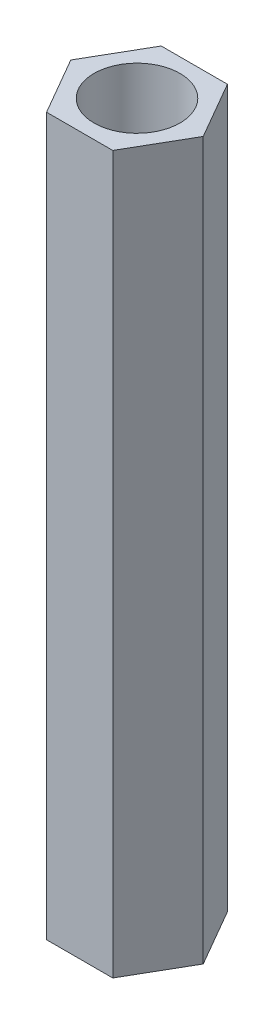
ISO-10303-21;
HEADER;
FILE_DESCRIPTION(('STEP AP214'),'2;1');
FILE_NAME('part.step','',(''),(''),'','','');
FILE_SCHEMA(('AUTOMOTIVE_DESIGN { 1 0 10303 214 1 1 1 1 }'));
ENDSEC;
DATA;
#1=APPLICATION_CONTEXT('core data for automotive mechanical design processes');
#2=APPLICATION_PROTOCOL_DEFINITION('international standard','automotive_design',2000,#1);
#3=PRODUCT_CONTEXT('',#1,'mechanical');
#4=PRODUCT('Part','Part','',(#3));
#5=PRODUCT_RELATED_PRODUCT_CATEGORY('part','',(#4));
#6=PRODUCT_DEFINITION_FORMATION('','',#4);
#7=PRODUCT_DEFINITION_CONTEXT('part definition',#1,'design');
#8=PRODUCT_DEFINITION('design','',#6,#7);
#9=PRODUCT_DEFINITION_SHAPE('','',#8);
#10=(LENGTH_UNIT() NAMED_UNIT(*) SI_UNIT(.MILLI.,.METRE.));
#11=(NAMED_UNIT(*) PLANE_ANGLE_UNIT() SI_UNIT($,.RADIAN.));
#12=(NAMED_UNIT(*) SI_UNIT($,.STERADIAN.) SOLID_ANGLE_UNIT());
#13=UNCERTAINTY_MEASURE_WITH_UNIT(LENGTH_MEASURE(1.E-05),#10,'distance_accuracy_value','');
#14=(GEOMETRIC_REPRESENTATION_CONTEXT(3) GLOBAL_UNCERTAINTY_ASSIGNED_CONTEXT((#13)) GLOBAL_UNIT_ASSIGNED_CONTEXT((#10,
#11,#12)) REPRESENTATION_CONTEXT('',''));
#15=CARTESIAN_POINT('',(0.,0.,0.));
#16=DIRECTION('',(0.,0.,1.));
#17=DIRECTION('',(1.,0.,0.));
#18=AXIS2_PLACEMENT_3D('',#15,#16,#17);
#19=CARTESIAN_POINT('',(1.15470053837925,25.,2.));
#20=DIRECTION('',(-0.866025403784439,0.,-0.5));
#21=DIRECTION('',(-0.5,0.,0.866025403784439));
#22=AXIS2_PLACEMENT_3D('',#19,#20,#21);
#23=PLANE('',#22);
#24=DIRECTION('',(0.5,0.,-0.866025403784439));
#25=VECTOR('',#24,1.);
#26=CARTESIAN_POINT('',(1.15470053837925,0.,2.));
#27=LINE('',#26,#25);
#28=CARTESIAN_POINT('',(1.15470053837925,0.,2.));
#29=VERTEX_POINT('',#28);
#30=CARTESIAN_POINT('',(2.3094010767585,0.,0.));
#31=VERTEX_POINT('',#30);
#32=EDGE_CURVE('E124',#29,#31,#27,.T.);
#33=ORIENTED_EDGE('',*,*,#32,.T.);
#34=DIRECTION('',(0.,-1.,0.));
#35=VECTOR('',#34,1.);
#36=CARTESIAN_POINT('',(2.3094010767585,25.,0.));
#37=LINE('',#36,#35);
#38=CARTESIAN_POINT('',(2.3094010767585,25.,0.));
#39=VERTEX_POINT('',#38);
#40=EDGE_CURVE('E11',#39,#31,#37,.T.);
#41=ORIENTED_EDGE('',*,*,#40,.F.);
#42=DIRECTION('',(0.5,0.,-0.866025403784439));
#43=VECTOR('',#42,1.);
#44=CARTESIAN_POINT('',(1.15470053837925,25.,2.));
#45=LINE('',#44,#43);
#46=CARTESIAN_POINT('',(1.15470053837925,25.,2.));
#47=VERTEX_POINT('',#46);
#48=EDGE_CURVE('E135',#47,#39,#45,.T.);
#49=ORIENTED_EDGE('',*,*,#48,.F.);
#50=DIRECTION('',(0.,-1.,0.));
#51=VECTOR('',#50,1.);
#52=CARTESIAN_POINT('',(1.15470053837925,25.,2.));
#53=LINE('',#52,#51);
#54=EDGE_CURVE('E120',#47,#29,#53,.T.);
#55=ORIENTED_EDGE('',*,*,#54,.T.);
#56=EDGE_LOOP('',(#33,#41,#49,#55));
#57=FACE_BOUND('',#56,.T.);
#58=ADVANCED_FACE('F40',(#57),#23,.F.);
#59=CARTESIAN_POINT('',(2.3094010767585,25.,0.));
#60=DIRECTION('',(-0.866025403784438,0.,0.5));
#61=DIRECTION('',(0.5,0.,0.866025403784439));
#62=AXIS2_PLACEMENT_3D('',#59,#60,#61);
#63=PLANE('',#62);
#64=DIRECTION('',(-0.5,0.,-0.866025403784438));
#65=VECTOR('',#64,1.);
#66=CARTESIAN_POINT('',(2.3094010767585,0.,0.));
#67=LINE('',#66,#65);
#68=CARTESIAN_POINT('',(1.15470053837925,0.,-2.));
#69=VERTEX_POINT('',#68);
#70=EDGE_CURVE('E127',#31,#69,#67,.T.);
#71=ORIENTED_EDGE('',*,*,#70,.T.);
#72=DIRECTION('',(0.,-1.,0.));
#73=VECTOR('',#72,1.);
#74=CARTESIAN_POINT('',(1.15470053837925,25.,-2.));
#75=LINE('',#74,#73);
#76=CARTESIAN_POINT('',(1.15470053837925,25.,-2.));
#77=VERTEX_POINT('',#76);
#78=EDGE_CURVE('E48',#77,#69,#75,.T.);
#79=ORIENTED_EDGE('',*,*,#78,.F.);
#80=DIRECTION('',(-0.5,0.,-0.866025403784438));
#81=VECTOR('',#80,1.);
#82=CARTESIAN_POINT('',(2.3094010767585,25.,0.));
#83=LINE('',#82,#81);
#84=EDGE_CURVE('E93',#39,#77,#83,.T.);
#85=ORIENTED_EDGE('',*,*,#84,.F.);
#86=ORIENTED_EDGE('',*,*,#40,.T.);
#87=EDGE_LOOP('',(#71,#79,#85,#86));
#88=FACE_BOUND('',#87,.T.);
#89=ADVANCED_FACE('F160',(#88),#63,.F.);
#90=CARTESIAN_POINT('',(1.15470053837925,25.,-2.));
#91=DIRECTION('',(0.,0.,1.));
#92=DIRECTION('',(1.,0.,0.));
#93=AXIS2_PLACEMENT_3D('',#90,#91,#92);
#94=PLANE('',#93);
#95=DIRECTION('',(-1.,0.,0.));
#96=VECTOR('',#95,1.);
#97=CARTESIAN_POINT('',(1.15470053837925,0.,-2.));
#98=LINE('',#97,#96);
#99=CARTESIAN_POINT('',(-1.15470053837925,0.,-2.));
#100=VERTEX_POINT('',#99);
#101=EDGE_CURVE('E130',#69,#100,#98,.T.);
#102=ORIENTED_EDGE('',*,*,#101,.T.);
#103=DIRECTION('',(0.,-1.,0.));
#104=VECTOR('',#103,1.);
#105=CARTESIAN_POINT('',(-1.15470053837925,25.,-2.));
#106=LINE('',#105,#104);
#107=CARTESIAN_POINT('',(-1.15470053837925,25.,-2.));
#108=VERTEX_POINT('',#107);
#109=EDGE_CURVE('E115',#108,#100,#106,.T.);
#110=ORIENTED_EDGE('',*,*,#109,.F.);
#111=DIRECTION('',(-1.,0.,0.));
#112=VECTOR('',#111,1.);
#113=CARTESIAN_POINT('',(1.15470053837925,25.,-2.));
#114=LINE('',#113,#112);
#115=EDGE_CURVE('E106',#77,#108,#114,.T.);
#116=ORIENTED_EDGE('',*,*,#115,.F.);
#117=ORIENTED_EDGE('',*,*,#78,.T.);
#118=EDGE_LOOP('',(#102,#110,#116,#117));
#119=FACE_BOUND('',#118,.T.);
#120=ADVANCED_FACE('F141',(#119),#94,.F.);
#121=CARTESIAN_POINT('',(-1.15470053837925,25.,-2.));
#122=DIRECTION('',(0.866025403784439,0.,0.5));
#123=DIRECTION('',(0.5,0.,-0.866025403784439));
#124=AXIS2_PLACEMENT_3D('',#121,#122,#123);
#125=PLANE('',#124);
#126=DIRECTION('',(-0.5,0.,0.866025403784439));
#127=VECTOR('',#126,1.);
#128=CARTESIAN_POINT('',(-1.15470053837925,0.,-2.));
#129=LINE('',#128,#127);
#130=CARTESIAN_POINT('',(-2.3094010767585,0.,0.));
#131=VERTEX_POINT('',#130);
#132=EDGE_CURVE('E114',#100,#131,#129,.T.);
#133=ORIENTED_EDGE('',*,*,#132,.T.);
#134=DIRECTION('',(0.,-1.,0.));
#135=VECTOR('',#134,1.);
#136=CARTESIAN_POINT('',(-2.3094010767585,25.,0.));
#137=LINE('',#136,#135);
#138=CARTESIAN_POINT('',(-2.3094010767585,25.,0.));
#139=VERTEX_POINT('',#138);
#140=EDGE_CURVE('E111',#139,#131,#137,.T.);
#141=ORIENTED_EDGE('',*,*,#140,.F.);
#142=DIRECTION('',(-0.5,0.,0.866025403784439));
#143=VECTOR('',#142,1.);
#144=CARTESIAN_POINT('',(-1.15470053837925,25.,-2.));
#145=LINE('',#144,#143);
#146=EDGE_CURVE('E100',#108,#139,#145,.T.);
#147=ORIENTED_EDGE('',*,*,#146,.F.);
#148=ORIENTED_EDGE('',*,*,#109,.T.);
#149=EDGE_LOOP('',(#133,#141,#147,#148));
#150=FACE_BOUND('',#149,.T.);
#151=ADVANCED_FACE('F112',(#150),#125,.F.);
#152=CARTESIAN_POINT('',(-2.3094010767585,25.,0.));
#153=DIRECTION('',(0.866025403784439,0.,-0.5));
#154=DIRECTION('',(-0.5,0.,-0.866025403784439));
#155=AXIS2_PLACEMENT_3D('',#152,#153,#154);
#156=PLANE('',#155);
#157=DIRECTION('',(0.5,0.,0.866025403784439));
#158=VECTOR('',#157,1.);
#159=CARTESIAN_POINT('',(-2.3094010767585,0.,0.));
#160=LINE('',#159,#158);
#161=CARTESIAN_POINT('',(-1.15470053837925,0.,2.));
#162=VERTEX_POINT('',#161);
#163=EDGE_CURVE('E79',#131,#162,#160,.T.);
#164=ORIENTED_EDGE('',*,*,#163,.T.);
#165=DIRECTION('',(0.,-1.,0.));
#166=VECTOR('',#165,1.);
#167=CARTESIAN_POINT('',(-1.15470053837925,25.,2.));
#168=LINE('',#167,#166);
#169=CARTESIAN_POINT('',(-1.15470053837925,25.,2.));
#170=VERTEX_POINT('',#169);
#171=EDGE_CURVE('E116',#170,#162,#168,.T.);
#172=ORIENTED_EDGE('',*,*,#171,.F.);
#173=DIRECTION('',(0.5,0.,0.866025403784439));
#174=VECTOR('',#173,1.);
#175=CARTESIAN_POINT('',(-2.3094010767585,25.,0.));
#176=LINE('',#175,#174);
#177=EDGE_CURVE('E104',#139,#170,#176,.T.);
#178=ORIENTED_EDGE('',*,*,#177,.F.);
#179=ORIENTED_EDGE('',*,*,#140,.T.);
#180=EDGE_LOOP('',(#164,#172,#178,#179));
#181=FACE_BOUND('',#180,.T.);
#182=ADVANCED_FACE('F118',(#181),#156,.F.);
#183=CARTESIAN_POINT('',(-1.15470053837925,25.,2.));
#184=DIRECTION('',(0.,0.,-1.));
#185=DIRECTION('',(-1.,0.,0.));
#186=AXIS2_PLACEMENT_3D('',#183,#184,#185);
#187=PLANE('',#186);
#188=DIRECTION('',(1.,0.,0.));
#189=VECTOR('',#188,1.);
#190=CARTESIAN_POINT('',(-1.15470053837925,0.,2.));
#191=LINE('',#190,#189);
#192=EDGE_CURVE('E85',#162,#29,#191,.T.);
#193=ORIENTED_EDGE('',*,*,#192,.T.);
#194=ORIENTED_EDGE('',*,*,#54,.F.);
#195=DIRECTION('',(1.,0.,0.));
#196=VECTOR('',#195,1.);
#197=CARTESIAN_POINT('',(-1.15470053837925,25.,2.));
#198=LINE('',#197,#196);
#199=EDGE_CURVE('E56',#170,#47,#198,.T.);
#200=ORIENTED_EDGE('',*,*,#199,.F.);
#201=ORIENTED_EDGE('',*,*,#171,.T.);
#202=EDGE_LOOP('',(#193,#194,#200,#201));
#203=FACE_BOUND('',#202,.T.);
#204=ADVANCED_FACE('F148',(#203),#187,.F.);
#205=CARTESIAN_POINT('',(0.,25.,0.));
#206=DIRECTION('',(0.,1.,0.));
#207=DIRECTION('',(0.,0.,1.));
#208=AXIS2_PLACEMENT_3D('',#205,#206,#207);
#209=PLANE('',#208);
#210=CARTESIAN_POINT('',(0.,25.,0.));
#211=DIRECTION('',(0.,1.,0.));
#212=DIRECTION('',(0.,0.,1.));
#213=AXIS2_PLACEMENT_3D('',#210,#211,#212);
#214=CIRCLE('',#213,1.5);
#215=CARTESIAN_POINT('',(0.,25.,1.5));
#216=VERTEX_POINT('',#215);
#217=EDGE_CURVE('E249',#216,#216,#214,.T.);
#218=ORIENTED_EDGE('',*,*,#217,.F.);
#219=EDGE_LOOP('',(#218));
#220=FACE_BOUND('',#219,.T.);
#221=ORIENTED_EDGE('',*,*,#48,.T.);
#222=ORIENTED_EDGE('',*,*,#84,.T.);
#223=ORIENTED_EDGE('',*,*,#115,.T.);
#224=ORIENTED_EDGE('',*,*,#146,.T.);
#225=ORIENTED_EDGE('',*,*,#177,.T.);
#226=ORIENTED_EDGE('',*,*,#199,.T.);
#227=EDGE_LOOP('',(#221,#222,#223,#224,#225,#226));
#228=FACE_BOUND('',#227,.T.);
#229=ADVANCED_FACE('F102',(#220,#228),#209,.T.);
#230=CARTESIAN_POINT('',(0.,0.,0.));
#231=DIRECTION('',(0.,1.,0.));
#232=DIRECTION('',(0.,0.,1.));
#233=AXIS2_PLACEMENT_3D('',#230,#231,#232);
#234=PLANE('',#233);
#235=CARTESIAN_POINT('',(0.,0.,0.));
#236=DIRECTION('',(0.,1.,0.));
#237=DIRECTION('',(0.,0.,1.));
#238=AXIS2_PLACEMENT_3D('',#235,#236,#237);
#239=CIRCLE('',#238,1.5);
#240=CARTESIAN_POINT('',(0.,0.,1.5));
#241=VERTEX_POINT('',#240);
#242=EDGE_CURVE('E128',#241,#241,#239,.T.);
#243=ORIENTED_EDGE('',*,*,#242,.T.);
#244=EDGE_LOOP('',(#243));
#245=FACE_BOUND('',#244,.T.);
#246=ORIENTED_EDGE('',*,*,#32,.F.);
#247=ORIENTED_EDGE('',*,*,#192,.F.);
#248=ORIENTED_EDGE('',*,*,#163,.F.);
#249=ORIENTED_EDGE('',*,*,#132,.F.);
#250=ORIENTED_EDGE('',*,*,#101,.F.);
#251=ORIENTED_EDGE('',*,*,#70,.F.);
#252=EDGE_LOOP('',(#246,#247,#248,#249,#250,#251));
#253=FACE_BOUND('',#252,.T.);
#254=ADVANCED_FACE('F144',(#245,#253),#234,.F.);
#255=CARTESIAN_POINT('',(0.,0.,0.));
#256=DIRECTION('',(0.,1.,0.));
#257=DIRECTION('',(0.,0.,1.));
#258=AXIS2_PLACEMENT_3D('',#255,#256,#257);
#259=CYLINDRICAL_SURFACE('',#258,1.5);
#260=ORIENTED_EDGE('',*,*,#242,.F.);
#261=EDGE_LOOP('',(#260));
#262=FACE_BOUND('',#261,.T.);
#263=ORIENTED_EDGE('',*,*,#217,.T.);
#264=EDGE_LOOP('',(#263));
#265=FACE_BOUND('',#264,.T.);
#266=ADVANCED_FACE('F202',(#262,#265),#259,.F.);
#267=CLOSED_SHELL('',(#58,#89,#120,#151,#182,#204,#229,#254,#266));
#268=MANIFOLD_SOLID_BREP('B2',#267);
#269=ADVANCED_BREP_SHAPE_REPRESENTATION('',(#18,#268),#14);
#270=SHAPE_DEFINITION_REPRESENTATION(#9,#269);
ENDSEC;
END-ISO-10303-21;
